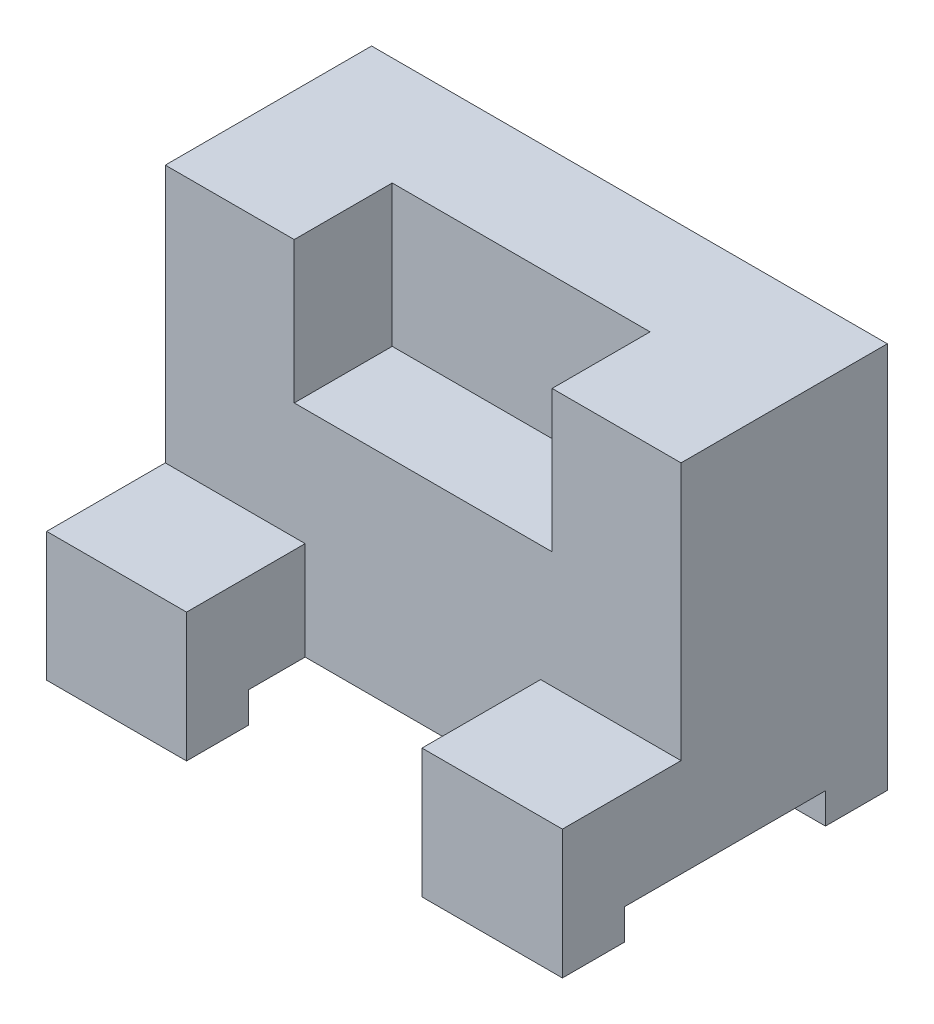
ISO-10303-21;
HEADER;
FILE_DESCRIPTION(('STEP AP214'),'2;1');
FILE_NAME('part.step','',(''),(''),'','','');
FILE_SCHEMA(('AUTOMOTIVE_DESIGN { 1 0 10303 214 1 1 1 1 }'));
ENDSEC;
DATA;
#1=APPLICATION_CONTEXT('core data for automotive mechanical design processes');
#2=APPLICATION_PROTOCOL_DEFINITION('international standard','automotive_design',2000,#1);
#3=PRODUCT_CONTEXT('',#1,'mechanical');
#4=PRODUCT('Part','Part','',(#3));
#5=PRODUCT_RELATED_PRODUCT_CATEGORY('part','',(#4));
#6=PRODUCT_DEFINITION_FORMATION('','',#4);
#7=PRODUCT_DEFINITION_CONTEXT('part definition',#1,'design');
#8=PRODUCT_DEFINITION('design','',#6,#7);
#9=PRODUCT_DEFINITION_SHAPE('','',#8);
#10=(LENGTH_UNIT() NAMED_UNIT(*) SI_UNIT(.MILLI.,.METRE.));
#11=(NAMED_UNIT(*) PLANE_ANGLE_UNIT() SI_UNIT($,.RADIAN.));
#12=(NAMED_UNIT(*) SI_UNIT($,.STERADIAN.) SOLID_ANGLE_UNIT());
#13=UNCERTAINTY_MEASURE_WITH_UNIT(LENGTH_MEASURE(1.E-05),#10,'distance_accuracy_value','');
#14=(GEOMETRIC_REPRESENTATION_CONTEXT(3) GLOBAL_UNCERTAINTY_ASSIGNED_CONTEXT((#13)) GLOBAL_UNIT_ASSIGNED_CONTEXT((#10,
#11,#12)) REPRESENTATION_CONTEXT('',''));
#15=CARTESIAN_POINT('',(0.,0.,0.));
#16=DIRECTION('',(0.,0.,1.));
#17=DIRECTION('',(1.,0.,0.));
#18=AXIS2_PLACEMENT_3D('',#15,#16,#17);
#19=CARTESIAN_POINT('',(0.,0.,63.));
#20=DIRECTION('',(0.,1.,0.));
#21=DIRECTION('',(0.,0.,1.));
#22=AXIS2_PLACEMENT_3D('',#19,#20,#21);
#23=PLANE('',#22);
#24=DIRECTION('',(0.,0.,-1.));
#25=VECTOR('',#24,1.);
#26=CARTESIAN_POINT('',(100.,0.,63.));
#27=LINE('',#26,#25);
#28=CARTESIAN_POINT('',(100.,0.,12.));
#29=VERTEX_POINT('',#28);
#30=CARTESIAN_POINT('',(100.,0.,0.));
#31=VERTEX_POINT('',#30);
#32=EDGE_CURVE('E191',#29,#31,#27,.T.);
#33=ORIENTED_EDGE('',*,*,#32,.F.);
#34=DIRECTION('',(-1.,0.,0.));
#35=VECTOR('',#34,1.);
#36=CARTESIAN_POINT('',(100.,0.,12.));
#37=LINE('',#36,#35);
#38=CARTESIAN_POINT('',(0.,0.,12.));
#39=VERTEX_POINT('',#38);
#40=EDGE_CURVE('E174',#29,#39,#37,.T.);
#41=ORIENTED_EDGE('',*,*,#40,.T.);
#42=DIRECTION('',(0.,0.,-1.));
#43=VECTOR('',#42,1.);
#44=CARTESIAN_POINT('',(0.,0.,63.));
#45=LINE('',#44,#43);
#46=CARTESIAN_POINT('',(0.,0.,0.));
#47=VERTEX_POINT('',#46);
#48=EDGE_CURVE('E276',#39,#47,#45,.T.);
#49=ORIENTED_EDGE('',*,*,#48,.T.);
#50=DIRECTION('',(1.,0.,0.));
#51=VECTOR('',#50,1.);
#52=CARTESIAN_POINT('',(0.,0.,0.));
#53=LINE('',#52,#51);
#54=EDGE_CURVE('E200',#47,#31,#53,.T.);
#55=ORIENTED_EDGE('',*,*,#54,.T.);
#56=EDGE_LOOP('',(#33,#41,#49,#55));
#57=FACE_BOUND('',#56,.T.);
#58=ADVANCED_FACE('F36',(#57),#23,.F.);
#59=CARTESIAN_POINT('',(0.,0.,63.));
#60=VERTEX_POINT('',#59);
#61=CARTESIAN_POINT('',(0.,0.,51.));
#62=VERTEX_POINT('',#61);
#63=EDGE_CURVE('E282',#60,#62,#45,.T.);
#64=ORIENTED_EDGE('',*,*,#63,.T.);
#65=DIRECTION('',(-1.,0.,0.));
#66=VECTOR('',#65,1.);
#67=CARTESIAN_POINT('',(100.,0.,51.));
#68=LINE('',#67,#66);
#69=CARTESIAN_POINT('',(27.1204188481676,0.,51.));
#70=VERTEX_POINT('',#69);
#71=EDGE_CURVE('E185',#70,#62,#68,.T.);
#72=ORIENTED_EDGE('',*,*,#71,.F.);
#73=DIRECTION('',(0.,0.,-1.));
#74=VECTOR('',#73,1.);
#75=CARTESIAN_POINT('',(27.1204188481675,0.,63.));
#76=LINE('',#75,#74);
#77=CARTESIAN_POINT('',(27.1204188481675,0.,63.));
#78=VERTEX_POINT('',#77);
#79=EDGE_CURVE('E294',#78,#70,#76,.T.);
#80=ORIENTED_EDGE('',*,*,#79,.F.);
#81=DIRECTION('',(1.,0.,0.));
#82=VECTOR('',#81,1.);
#83=CARTESIAN_POINT('',(0.,0.,63.));
#84=LINE('',#83,#82);
#85=EDGE_CURVE('E260',#60,#78,#84,.T.);
#86=ORIENTED_EDGE('',*,*,#85,.F.);
#87=EDGE_LOOP('',(#64,#72,#80,#86));
#88=FACE_BOUND('',#87,.T.);
#89=ADVANCED_FACE('F480',(#88),#23,.F.);
#90=CARTESIAN_POINT('',(0.,75.,40.));
#91=DIRECTION('',(0.,1.,0.));
#92=DIRECTION('',(0.,0.,1.));
#93=AXIS2_PLACEMENT_3D('',#90,#91,#92);
#94=PLANE('',#93);
#95=DIRECTION('',(1.,0.,0.));
#96=VECTOR('',#95,1.);
#97=CARTESIAN_POINT('',(0.,75.,40.));
#98=LINE('',#97,#96);
#99=CARTESIAN_POINT('',(0.,75.,40.));
#100=VERTEX_POINT('',#99);
#101=CARTESIAN_POINT('',(25.,75.,40.));
#102=VERTEX_POINT('',#101);
#103=EDGE_CURVE('E220',#100,#102,#98,.T.);
#104=ORIENTED_EDGE('',*,*,#103,.T.);
#105=DIRECTION('',(0.,0.,1.));
#106=VECTOR('',#105,1.);
#107=CARTESIAN_POINT('',(25.,75.,21.));
#108=LINE('',#107,#106);
#109=CARTESIAN_POINT('',(25.,75.,21.));
#110=VERTEX_POINT('',#109);
#111=EDGE_CURVE('E372',#110,#102,#108,.T.);
#112=ORIENTED_EDGE('',*,*,#111,.F.);
#113=DIRECTION('',(-1.,0.,0.));
#114=VECTOR('',#113,1.);
#115=CARTESIAN_POINT('',(0.,75.,21.));
#116=LINE('',#115,#114);
#117=CARTESIAN_POINT('',(75.,75.,21.));
#118=VERTEX_POINT('',#117);
#119=EDGE_CURVE('E429',#118,#110,#116,.T.);
#120=ORIENTED_EDGE('',*,*,#119,.F.);
#121=DIRECTION('',(0.,0.,1.));
#122=VECTOR('',#121,1.);
#123=CARTESIAN_POINT('',(75.,75.,21.));
#124=LINE('',#123,#122);
#125=CARTESIAN_POINT('',(75.,75.,40.));
#126=VERTEX_POINT('',#125);
#127=EDGE_CURVE('E397',#118,#126,#124,.T.);
#128=ORIENTED_EDGE('',*,*,#127,.T.);
#129=CARTESIAN_POINT('',(100.,75.,40.));
#130=VERTEX_POINT('',#129);
#131=EDGE_CURVE('E225',#126,#130,#98,.T.);
#132=ORIENTED_EDGE('',*,*,#131,.T.);
#133=DIRECTION('',(0.,0.,-1.));
#134=VECTOR('',#133,1.);
#135=CARTESIAN_POINT('',(100.,75.,40.));
#136=LINE('',#135,#134);
#137=CARTESIAN_POINT('',(100.,75.,0.));
#138=VERTEX_POINT('',#137);
#139=EDGE_CURVE('E247',#130,#138,#136,.T.);
#140=ORIENTED_EDGE('',*,*,#139,.T.);
#141=DIRECTION('',(1.,0.,0.));
#142=VECTOR('',#141,1.);
#143=CARTESIAN_POINT('',(0.,75.,0.));
#144=LINE('',#143,#142);
#145=CARTESIAN_POINT('',(0.,75.,0.));
#146=VERTEX_POINT('',#145);
#147=EDGE_CURVE('E219',#146,#138,#144,.T.);
#148=ORIENTED_EDGE('',*,*,#147,.F.);
#149=DIRECTION('',(0.,0.,-1.));
#150=VECTOR('',#149,1.);
#151=CARTESIAN_POINT('',(0.,75.,40.));
#152=LINE('',#151,#150);
#153=EDGE_CURVE('E256',#100,#146,#152,.T.);
#154=ORIENTED_EDGE('',*,*,#153,.F.);
#155=EDGE_LOOP('',(#104,#112,#120,#128,#132,#140,#148,#154));
#156=FACE_BOUND('',#155,.T.);
#157=ADVANCED_FACE('F369',(#156),#94,.T.);
#158=CARTESIAN_POINT('',(0.,0.,40.));
#159=DIRECTION('',(0.,0.,1.));
#160=DIRECTION('',(1.,0.,0.));
#161=AXIS2_PLACEMENT_3D('',#158,#159,#160);
#162=PLANE('',#161);
#163=DIRECTION('',(-1.,0.,0.));
#164=VECTOR('',#163,1.);
#165=CARTESIAN_POINT('',(0.,5.94692633548565,40.));
#166=LINE('',#165,#164);
#167=CARTESIAN_POINT('',(72.7748691099477,5.94692633548565,40.));
#168=VERTEX_POINT('',#167);
#169=CARTESIAN_POINT('',(27.1204188481675,5.94692633548565,40.));
#170=VERTEX_POINT('',#169);
#171=EDGE_CURVE('E320',#168,#170,#166,.T.);
#172=ORIENTED_EDGE('',*,*,#171,.F.);
#173=DIRECTION('',(0.,1.,0.));
#174=VECTOR('',#173,1.);
#175=CARTESIAN_POINT('',(72.7748691099477,0.,40.));
#176=LINE('',#175,#174);
#177=CARTESIAN_POINT('',(72.7748691099477,25.,40.));
#178=VERTEX_POINT('',#177);
#179=EDGE_CURVE('E236',#168,#178,#176,.T.);
#180=ORIENTED_EDGE('',*,*,#179,.T.);
#181=DIRECTION('',(-1.,0.,0.));
#182=VECTOR('',#181,1.);
#183=CARTESIAN_POINT('',(0.,25.,40.));
#184=LINE('',#183,#182);
#185=CARTESIAN_POINT('',(100.,25.,40.));
#186=VERTEX_POINT('',#185);
#187=EDGE_CURVE('E239',#186,#178,#184,.T.);
#188=ORIENTED_EDGE('',*,*,#187,.F.);
#189=DIRECTION('',(0.,1.,0.));
#190=VECTOR('',#189,1.);
#191=CARTESIAN_POINT('',(100.,0.,40.));
#192=LINE('',#191,#190);
#193=EDGE_CURVE('E243',#186,#130,#192,.T.);
#194=ORIENTED_EDGE('',*,*,#193,.T.);
#195=ORIENTED_EDGE('',*,*,#131,.F.);
#196=DIRECTION('',(0.,1.,0.));
#197=VECTOR('',#196,1.);
#198=CARTESIAN_POINT('',(75.,0.,40.));
#199=LINE('',#198,#197);
#200=CARTESIAN_POINT('',(75.,47.565445026178,40.));
#201=VERTEX_POINT('',#200);
#202=EDGE_CURVE('E332',#201,#126,#199,.T.);
#203=ORIENTED_EDGE('',*,*,#202,.F.);
#204=DIRECTION('',(-1.,0.,0.));
#205=VECTOR('',#204,1.);
#206=CARTESIAN_POINT('',(0.,47.565445026178,40.));
#207=LINE('',#206,#205);
#208=CARTESIAN_POINT('',(25.,47.565445026178,40.));
#209=VERTEX_POINT('',#208);
#210=EDGE_CURVE('E374',#201,#209,#207,.T.);
#211=ORIENTED_EDGE('',*,*,#210,.T.);
#212=DIRECTION('',(0.,1.,0.));
#213=VECTOR('',#212,1.);
#214=CARTESIAN_POINT('',(25.,0.,40.));
#215=LINE('',#214,#213);
#216=EDGE_CURVE('E60',#209,#102,#215,.T.);
#217=ORIENTED_EDGE('',*,*,#216,.T.);
#218=ORIENTED_EDGE('',*,*,#103,.F.);
#219=DIRECTION('',(0.,1.,0.));
#220=VECTOR('',#219,1.);
#221=CARTESIAN_POINT('',(0.,0.,40.));
#222=LINE('',#221,#220);
#223=CARTESIAN_POINT('',(0.,25.,40.));
#224=VERTEX_POINT('',#223);
#225=EDGE_CURVE('E224',#224,#100,#222,.T.);
#226=ORIENTED_EDGE('',*,*,#225,.F.);
#227=DIRECTION('',(1.,0.,0.));
#228=VECTOR('',#227,1.);
#229=CARTESIAN_POINT('',(0.,25.,40.));
#230=LINE('',#229,#228);
#231=CARTESIAN_POINT('',(27.1204188481675,25.,40.));
#232=VERTEX_POINT('',#231);
#233=EDGE_CURVE('E229',#224,#232,#230,.T.);
#234=ORIENTED_EDGE('',*,*,#233,.T.);
#235=DIRECTION('',(0.,1.,0.));
#236=VECTOR('',#235,1.);
#237=CARTESIAN_POINT('',(27.1204188481675,0.,40.));
#238=LINE('',#237,#236);
#239=EDGE_CURVE('E233',#170,#232,#238,.T.);
#240=ORIENTED_EDGE('',*,*,#239,.F.);
#241=EDGE_LOOP('',(#172,#180,#188,#194,#195,#203,#211,#217,#218,#226,#234,#240));
#242=FACE_BOUND('',#241,.T.);
#243=ADVANCED_FACE('F318',(#242),#162,.T.);
#244=DIRECTION('',(0.,0.,-1.));
#245=VECTOR('',#244,1.);
#246=CARTESIAN_POINT('',(72.7748691099477,0.,63.));
#247=LINE('',#246,#245);
#248=CARTESIAN_POINT('',(72.7748691099477,0.,63.));
#249=VERTEX_POINT('',#248);
#250=CARTESIAN_POINT('',(72.7748691099477,0.,51.));
#251=VERTEX_POINT('',#250);
#252=EDGE_CURVE('E210',#249,#251,#247,.T.);
#253=ORIENTED_EDGE('',*,*,#252,.T.);
#254=CARTESIAN_POINT('',(100.,0.,51.));
#255=VERTEX_POINT('',#254);
#256=EDGE_CURVE('E52',#255,#251,#68,.T.);
#257=ORIENTED_EDGE('',*,*,#256,.F.);
#258=CARTESIAN_POINT('',(100.,0.,63.));
#259=VERTEX_POINT('',#258);
#260=EDGE_CURVE('E203',#259,#255,#27,.T.);
#261=ORIENTED_EDGE('',*,*,#260,.F.);
#262=DIRECTION('',(1.,0.,0.));
#263=VECTOR('',#262,1.);
#264=CARTESIAN_POINT('',(0.,0.,63.));
#265=LINE('',#264,#263);
#266=EDGE_CURVE('E405',#249,#259,#265,.T.);
#267=ORIENTED_EDGE('',*,*,#266,.F.);
#268=EDGE_LOOP('',(#253,#257,#261,#267));
#269=FACE_BOUND('',#268,.T.);
#270=ADVANCED_FACE('F38',(#269),#23,.F.);
#271=CARTESIAN_POINT('',(27.1204188481675,0.,63.));
#272=DIRECTION('',(-1.,0.,0.));
#273=DIRECTION('',(0.,0.,1.));
#274=AXIS2_PLACEMENT_3D('',#271,#272,#273);
#275=PLANE('',#274);
#276=DIRECTION('',(0.,1.,0.));
#277=VECTOR('',#276,1.);
#278=CARTESIAN_POINT('',(27.1204188481675,0.,51.));
#279=LINE('',#278,#277);
#280=CARTESIAN_POINT('',(27.1204188481676,5.94692633548565,51.));
#281=VERTEX_POINT('',#280);
#282=EDGE_CURVE('E442',#70,#281,#279,.T.);
#283=ORIENTED_EDGE('',*,*,#282,.T.);
#284=DIRECTION('',(0.,0.,-1.));
#285=VECTOR('',#284,1.);
#286=CARTESIAN_POINT('',(27.1204188481675,5.94692633548565,63.));
#287=LINE('',#286,#285);
#288=EDGE_CURVE('E376',#281,#170,#287,.T.);
#289=ORIENTED_EDGE('',*,*,#288,.T.);
#290=ORIENTED_EDGE('',*,*,#239,.T.);
#291=DIRECTION('',(0.,0.,-1.));
#292=VECTOR('',#291,1.);
#293=CARTESIAN_POINT('',(27.1204188481675,25.,63.));
#294=LINE('',#293,#292);
#295=CARTESIAN_POINT('',(27.1204188481675,25.,63.));
#296=VERTEX_POINT('',#295);
#297=EDGE_CURVE('E290',#296,#232,#294,.T.);
#298=ORIENTED_EDGE('',*,*,#297,.F.);
#299=DIRECTION('',(0.,1.,0.));
#300=VECTOR('',#299,1.);
#301=CARTESIAN_POINT('',(27.1204188481675,0.,63.));
#302=LINE('',#301,#300);
#303=EDGE_CURVE('E264',#78,#296,#302,.T.);
#304=ORIENTED_EDGE('',*,*,#303,.F.);
#305=ORIENTED_EDGE('',*,*,#79,.T.);
#306=EDGE_LOOP('',(#283,#289,#290,#298,#304,#305));
#307=FACE_BOUND('',#306,.T.);
#308=ADVANCED_FACE('F486',(#307),#275,.F.);
#309=CARTESIAN_POINT('',(0.,25.,63.));
#310=DIRECTION('',(0.,1.,0.));
#311=DIRECTION('',(0.,0.,1.));
#312=AXIS2_PLACEMENT_3D('',#309,#310,#311);
#313=PLANE('',#312);
#314=ORIENTED_EDGE('',*,*,#233,.F.);
#315=DIRECTION('',(0.,0.,-1.));
#316=VECTOR('',#315,1.);
#317=CARTESIAN_POINT('',(0.,25.,63.));
#318=LINE('',#317,#316);
#319=CARTESIAN_POINT('',(0.,25.,63.));
#320=VERTEX_POINT('',#319);
#321=EDGE_CURVE('E286',#320,#224,#318,.T.);
#322=ORIENTED_EDGE('',*,*,#321,.F.);
#323=DIRECTION('',(1.,0.,0.));
#324=VECTOR('',#323,1.);
#325=CARTESIAN_POINT('',(0.,25.,63.));
#326=LINE('',#325,#324);
#327=EDGE_CURVE('E268',#320,#296,#326,.T.);
#328=ORIENTED_EDGE('',*,*,#327,.T.);
#329=ORIENTED_EDGE('',*,*,#297,.T.);
#330=EDGE_LOOP('',(#314,#322,#328,#329));
#331=FACE_BOUND('',#330,.T.);
#332=ADVANCED_FACE('F491',(#331),#313,.T.);
#333=CARTESIAN_POINT('',(0.,0.,63.));
#334=DIRECTION('',(-1.,0.,0.));
#335=DIRECTION('',(0.,0.,1.));
#336=AXIS2_PLACEMENT_3D('',#333,#334,#335);
#337=PLANE('',#336);
#338=DIRECTION('',(0.,-1.,0.));
#339=VECTOR('',#338,1.);
#340=CARTESIAN_POINT('',(0.,0.,12.));
#341=LINE('',#340,#339);
#342=CARTESIAN_POINT('',(0.,5.94692633548565,12.));
#343=VERTEX_POINT('',#342);
#344=EDGE_CURVE('E180',#343,#39,#341,.T.);
#345=ORIENTED_EDGE('',*,*,#344,.F.);
#346=DIRECTION('',(0.,0.,-1.));
#347=VECTOR('',#346,1.);
#348=CARTESIAN_POINT('',(0.,5.94692633548565,12.));
#349=LINE('',#348,#347);
#350=CARTESIAN_POINT('',(0.,5.94692633548565,51.));
#351=VERTEX_POINT('',#350);
#352=EDGE_CURVE('E197',#351,#343,#349,.T.);
#353=ORIENTED_EDGE('',*,*,#352,.F.);
#354=DIRECTION('',(0.,1.,0.));
#355=VECTOR('',#354,1.);
#356=CARTESIAN_POINT('',(0.,0.,51.));
#357=LINE('',#356,#355);
#358=EDGE_CURVE('E453',#62,#351,#357,.T.);
#359=ORIENTED_EDGE('',*,*,#358,.F.);
#360=ORIENTED_EDGE('',*,*,#63,.F.);
#361=DIRECTION('',(0.,1.,0.));
#362=VECTOR('',#361,1.);
#363=CARTESIAN_POINT('',(0.,0.,63.));
#364=LINE('',#363,#362);
#365=EDGE_CURVE('E272',#60,#320,#364,.T.);
#366=ORIENTED_EDGE('',*,*,#365,.T.);
#367=ORIENTED_EDGE('',*,*,#321,.T.);
#368=ORIENTED_EDGE('',*,*,#225,.T.);
#369=ORIENTED_EDGE('',*,*,#153,.T.);
#370=DIRECTION('',(0.,1.,0.));
#371=VECTOR('',#370,1.);
#372=CARTESIAN_POINT('',(0.,0.,0.));
#373=LINE('',#372,#371);
#374=EDGE_CURVE('E265',#47,#146,#373,.T.);
#375=ORIENTED_EDGE('',*,*,#374,.F.);
#376=ORIENTED_EDGE('',*,*,#48,.F.);
#377=EDGE_LOOP('',(#345,#353,#359,#360,#366,#367,#368,#369,#375,#376));
#378=FACE_BOUND('',#377,.T.);
#379=ADVANCED_FACE('F366',(#378),#337,.T.);
#380=CARTESIAN_POINT('',(0.,0.,63.));
#381=DIRECTION('',(0.,0.,1.));
#382=DIRECTION('',(1.,0.,0.));
#383=AXIS2_PLACEMENT_3D('',#380,#381,#382);
#384=PLANE('',#383);
#385=ORIENTED_EDGE('',*,*,#85,.T.);
#386=ORIENTED_EDGE('',*,*,#303,.T.);
#387=ORIENTED_EDGE('',*,*,#327,.F.);
#388=ORIENTED_EDGE('',*,*,#365,.F.);
#389=EDGE_LOOP('',(#385,#386,#387,#388));
#390=FACE_BOUND('',#389,.T.);
#391=ADVANCED_FACE('F502',(#390),#384,.T.);
#392=CARTESIAN_POINT('',(0.,0.,0.));
#393=DIRECTION('',(0.,0.,1.));
#394=DIRECTION('',(1.,0.,0.));
#395=AXIS2_PLACEMENT_3D('',#392,#393,#394);
#396=PLANE('',#395);
#397=ORIENTED_EDGE('',*,*,#374,.T.);
#398=ORIENTED_EDGE('',*,*,#147,.T.);
#399=DIRECTION('',(0.,1.,0.));
#400=VECTOR('',#399,1.);
#401=CARTESIAN_POINT('',(100.,0.,0.));
#402=LINE('',#401,#400);
#403=EDGE_CURVE('E251',#31,#138,#402,.T.);
#404=ORIENTED_EDGE('',*,*,#403,.F.);
#405=ORIENTED_EDGE('',*,*,#54,.F.);
#406=EDGE_LOOP('',(#397,#398,#404,#405));
#407=FACE_BOUND('',#406,.T.);
#408=ADVANCED_FACE('F365',(#407),#396,.F.);
#409=CARTESIAN_POINT('',(100.,0.,40.));
#410=DIRECTION('',(-1.,0.,0.));
#411=DIRECTION('',(0.,0.,1.));
#412=AXIS2_PLACEMENT_3D('',#409,#410,#411);
#413=PLANE('',#412);
#414=DIRECTION('',(0.,0.,-1.));
#415=VECTOR('',#414,1.);
#416=CARTESIAN_POINT('',(100.,5.94692633548565,12.));
#417=LINE('',#416,#415);
#418=CARTESIAN_POINT('',(100.,5.94692633548565,51.));
#419=VERTEX_POINT('',#418);
#420=CARTESIAN_POINT('',(100.,5.94692633548565,12.));
#421=VERTEX_POINT('',#420);
#422=EDGE_CURVE('E186',#419,#421,#417,.T.);
#423=ORIENTED_EDGE('',*,*,#422,.T.);
#424=DIRECTION('',(0.,-1.,0.));
#425=VECTOR('',#424,1.);
#426=CARTESIAN_POINT('',(100.,0.,12.));
#427=LINE('',#426,#425);
#428=EDGE_CURVE('E177',#421,#29,#427,.T.);
#429=ORIENTED_EDGE('',*,*,#428,.T.);
#430=ORIENTED_EDGE('',*,*,#32,.T.);
#431=ORIENTED_EDGE('',*,*,#403,.T.);
#432=ORIENTED_EDGE('',*,*,#139,.F.);
#433=ORIENTED_EDGE('',*,*,#193,.F.);
#434=DIRECTION('',(0.,0.,-1.));
#435=VECTOR('',#434,1.);
#436=CARTESIAN_POINT('',(100.,25.,63.));
#437=LINE('',#436,#435);
#438=CARTESIAN_POINT('',(100.,25.,63.));
#439=VERTEX_POINT('',#438);
#440=EDGE_CURVE('E204',#439,#186,#437,.T.);
#441=ORIENTED_EDGE('',*,*,#440,.F.);
#442=DIRECTION('',(0.,1.,0.));
#443=VECTOR('',#442,1.);
#444=CARTESIAN_POINT('',(100.,0.,63.));
#445=LINE('',#444,#443);
#446=EDGE_CURVE('E327',#259,#439,#445,.T.);
#447=ORIENTED_EDGE('',*,*,#446,.F.);
#448=ORIENTED_EDGE('',*,*,#260,.T.);
#449=DIRECTION('',(0.,1.,0.));
#450=VECTOR('',#449,1.);
#451=CARTESIAN_POINT('',(100.,0.,51.));
#452=LINE('',#451,#450);
#453=EDGE_CURVE('E196',#255,#419,#452,.T.);
#454=ORIENTED_EDGE('',*,*,#453,.T.);
#455=EDGE_LOOP('',(#423,#429,#430,#431,#432,#433,#441,#447,#448,#454));
#456=FACE_BOUND('',#455,.T.);
#457=ADVANCED_FACE('F189',(#456),#413,.F.);
#458=CARTESIAN_POINT('',(72.7748691099477,0.,63.));
#459=DIRECTION('',(-1.,0.,0.));
#460=DIRECTION('',(0.,0.,1.));
#461=AXIS2_PLACEMENT_3D('',#458,#459,#460);
#462=PLANE('',#461);
#463=DIRECTION('',(0.,0.,-1.));
#464=VECTOR('',#463,1.);
#465=CARTESIAN_POINT('',(72.7748691099477,5.94692633548565,63.));
#466=LINE('',#465,#464);
#467=CARTESIAN_POINT('',(72.7748691099477,5.94692633548565,51.));
#468=VERTEX_POINT('',#467);
#469=EDGE_CURVE('E11',#468,#168,#466,.T.);
#470=ORIENTED_EDGE('',*,*,#469,.F.);
#471=DIRECTION('',(0.,1.,0.));
#472=VECTOR('',#471,1.);
#473=CARTESIAN_POINT('',(72.7748691099477,0.,51.));
#474=LINE('',#473,#472);
#475=EDGE_CURVE('E45',#251,#468,#474,.T.);
#476=ORIENTED_EDGE('',*,*,#475,.F.);
#477=ORIENTED_EDGE('',*,*,#252,.F.);
#478=DIRECTION('',(0.,1.,0.));
#479=VECTOR('',#478,1.);
#480=CARTESIAN_POINT('',(72.7748691099477,0.,63.));
#481=LINE('',#480,#479);
#482=CARTESIAN_POINT('',(72.7748691099477,25.,63.));
#483=VERTEX_POINT('',#482);
#484=EDGE_CURVE('E402',#249,#483,#481,.T.);
#485=ORIENTED_EDGE('',*,*,#484,.T.);
#486=DIRECTION('',(0.,0.,-1.));
#487=VECTOR('',#486,1.);
#488=CARTESIAN_POINT('',(72.7748691099477,25.,63.));
#489=LINE('',#488,#487);
#490=EDGE_CURVE('E212',#483,#178,#489,.T.);
#491=ORIENTED_EDGE('',*,*,#490,.T.);
#492=ORIENTED_EDGE('',*,*,#179,.F.);
#493=EDGE_LOOP('',(#470,#476,#477,#485,#491,#492));
#494=FACE_BOUND('',#493,.T.);
#495=ADVANCED_FACE('F312',(#494),#462,.T.);
#496=CARTESIAN_POINT('',(0.,25.,63.));
#497=DIRECTION('',(0.,-1.,0.));
#498=DIRECTION('',(1.,0.,0.));
#499=AXIS2_PLACEMENT_3D('',#496,#497,#498);
#500=PLANE('',#499);
#501=ORIENTED_EDGE('',*,*,#187,.T.);
#502=ORIENTED_EDGE('',*,*,#490,.F.);
#503=DIRECTION('',(-1.,0.,0.));
#504=VECTOR('',#503,1.);
#505=CARTESIAN_POINT('',(0.,25.,63.));
#506=LINE('',#505,#504);
#507=EDGE_CURVE('E325',#439,#483,#506,.T.);
#508=ORIENTED_EDGE('',*,*,#507,.F.);
#509=ORIENTED_EDGE('',*,*,#440,.T.);
#510=EDGE_LOOP('',(#501,#502,#508,#509));
#511=FACE_BOUND('',#510,.T.);
#512=ADVANCED_FACE('F322',(#511),#500,.F.);
#513=CARTESIAN_POINT('',(0.,0.,63.));
#514=DIRECTION('',(0.,0.,1.));
#515=DIRECTION('',(1.,0.,0.));
#516=AXIS2_PLACEMENT_3D('',#513,#514,#515);
#517=PLANE('',#516);
#518=ORIENTED_EDGE('',*,*,#484,.F.);
#519=ORIENTED_EDGE('',*,*,#266,.T.);
#520=ORIENTED_EDGE('',*,*,#446,.T.);
#521=ORIENTED_EDGE('',*,*,#507,.T.);
#522=EDGE_LOOP('',(#518,#519,#520,#521));
#523=FACE_BOUND('',#522,.T.);
#524=ADVANCED_FACE('F468',(#523),#517,.T.);
#525=CARTESIAN_POINT('',(25.,0.,21.));
#526=DIRECTION('',(1.,0.,0.));
#527=DIRECTION('',(0.,1.,0.));
#528=AXIS2_PLACEMENT_3D('',#525,#526,#527);
#529=PLANE('',#528);
#530=ORIENTED_EDGE('',*,*,#216,.F.);
#531=DIRECTION('',(0.,0.,1.));
#532=VECTOR('',#531,1.);
#533=CARTESIAN_POINT('',(25.,47.565445026178,21.));
#534=LINE('',#533,#532);
#535=CARTESIAN_POINT('',(25.,47.565445026178,21.));
#536=VERTEX_POINT('',#535);
#537=EDGE_CURVE('E391',#536,#209,#534,.T.);
#538=ORIENTED_EDGE('',*,*,#537,.F.);
#539=DIRECTION('',(0.,1.,0.));
#540=VECTOR('',#539,1.);
#541=CARTESIAN_POINT('',(25.,0.,21.));
#542=LINE('',#541,#540);
#543=EDGE_CURVE('E390',#536,#110,#542,.T.);
#544=ORIENTED_EDGE('',*,*,#543,.T.);
#545=ORIENTED_EDGE('',*,*,#111,.T.);
#546=EDGE_LOOP('',(#530,#538,#544,#545));
#547=FACE_BOUND('',#546,.T.);
#548=ADVANCED_FACE('F470',(#547),#529,.T.);
#549=CARTESIAN_POINT('',(75.,0.,21.));
#550=DIRECTION('',(1.,0.,0.));
#551=DIRECTION('',(0.,1.,0.));
#552=AXIS2_PLACEMENT_3D('',#549,#550,#551);
#553=PLANE('',#552);
#554=ORIENTED_EDGE('',*,*,#202,.T.);
#555=ORIENTED_EDGE('',*,*,#127,.F.);
#556=DIRECTION('',(0.,1.,0.));
#557=VECTOR('',#556,1.);
#558=CARTESIAN_POINT('',(75.,0.,21.));
#559=LINE('',#558,#557);
#560=CARTESIAN_POINT('',(75.,47.565445026178,21.));
#561=VERTEX_POINT('',#560);
#562=EDGE_CURVE('E425',#561,#118,#559,.T.);
#563=ORIENTED_EDGE('',*,*,#562,.F.);
#564=DIRECTION('',(0.,0.,1.));
#565=VECTOR('',#564,1.);
#566=CARTESIAN_POINT('',(75.,47.565445026178,21.));
#567=LINE('',#566,#565);
#568=EDGE_CURVE('E394',#561,#201,#567,.T.);
#569=ORIENTED_EDGE('',*,*,#568,.T.);
#570=EDGE_LOOP('',(#554,#555,#563,#569));
#571=FACE_BOUND('',#570,.T.);
#572=ADVANCED_FACE('F476',(#571),#553,.F.);
#573=CARTESIAN_POINT('',(0.,47.565445026178,21.));
#574=DIRECTION('',(0.,1.,0.));
#575=DIRECTION('',(-1.,0.,0.));
#576=AXIS2_PLACEMENT_3D('',#573,#574,#575);
#577=PLANE('',#576);
#578=ORIENTED_EDGE('',*,*,#210,.F.);
#579=ORIENTED_EDGE('',*,*,#568,.F.);
#580=DIRECTION('',(-1.,0.,0.));
#581=VECTOR('',#580,1.);
#582=CARTESIAN_POINT('',(0.,47.565445026178,21.));
#583=LINE('',#582,#581);
#584=EDGE_CURVE('E385',#561,#536,#583,.T.);
#585=ORIENTED_EDGE('',*,*,#584,.T.);
#586=ORIENTED_EDGE('',*,*,#537,.T.);
#587=EDGE_LOOP('',(#578,#579,#585,#586));
#588=FACE_BOUND('',#587,.T.);
#589=ADVANCED_FACE('F573',(#588),#577,.T.);
#590=CARTESIAN_POINT('',(0.,0.,21.));
#591=DIRECTION('',(0.,0.,1.));
#592=DIRECTION('',(1.,0.,0.));
#593=AXIS2_PLACEMENT_3D('',#590,#591,#592);
#594=PLANE('',#593);
#595=ORIENTED_EDGE('',*,*,#543,.F.);
#596=ORIENTED_EDGE('',*,*,#584,.F.);
#597=ORIENTED_EDGE('',*,*,#562,.T.);
#598=ORIENTED_EDGE('',*,*,#119,.T.);
#599=EDGE_LOOP('',(#595,#596,#597,#598));
#600=FACE_BOUND('',#599,.T.);
#601=ADVANCED_FACE('F544',(#600),#594,.T.);
#602=CARTESIAN_POINT('',(100.,5.94692633548565,12.));
#603=DIRECTION('',(0.,1.,0.));
#604=DIRECTION('',(0.,0.,1.));
#605=AXIS2_PLACEMENT_3D('',#602,#603,#604);
#606=PLANE('',#605);
#607=DIRECTION('',(-1.,0.,0.));
#608=VECTOR('',#607,1.);
#609=CARTESIAN_POINT('',(100.,5.94692633548565,51.));
#610=LINE('',#609,#608);
#611=EDGE_CURVE('E309',#281,#351,#610,.T.);
#612=ORIENTED_EDGE('',*,*,#611,.T.);
#613=ORIENTED_EDGE('',*,*,#352,.T.);
#614=DIRECTION('',(-1.,0.,0.));
#615=VECTOR('',#614,1.);
#616=CARTESIAN_POINT('',(100.,5.94692633548565,12.));
#617=LINE('',#616,#615);
#618=EDGE_CURVE('E308',#421,#343,#617,.T.);
#619=ORIENTED_EDGE('',*,*,#618,.F.);
#620=ORIENTED_EDGE('',*,*,#422,.F.);
#621=EDGE_CURVE('E301',#419,#468,#610,.T.);
#622=ORIENTED_EDGE('',*,*,#621,.T.);
#623=ORIENTED_EDGE('',*,*,#469,.T.);
#624=ORIENTED_EDGE('',*,*,#171,.T.);
#625=ORIENTED_EDGE('',*,*,#288,.F.);
#626=EDGE_LOOP('',(#612,#613,#619,#620,#622,#623,#624,#625));
#627=FACE_BOUND('',#626,.T.);
#628=ADVANCED_FACE('F305',(#627),#606,.F.);
#629=CARTESIAN_POINT('',(100.,0.,51.));
#630=DIRECTION('',(0.,0.,1.));
#631=DIRECTION('',(1.,0.,0.));
#632=AXIS2_PLACEMENT_3D('',#629,#630,#631);
#633=PLANE('',#632);
#634=ORIENTED_EDGE('',*,*,#71,.T.);
#635=ORIENTED_EDGE('',*,*,#358,.T.);
#636=ORIENTED_EDGE('',*,*,#611,.F.);
#637=ORIENTED_EDGE('',*,*,#282,.F.);
#638=EDGE_LOOP('',(#634,#635,#636,#637));
#639=FACE_BOUND('',#638,.T.);
#640=ADVANCED_FACE('F522',(#639),#633,.F.);
#641=CARTESIAN_POINT('',(100.,0.,12.));
#642=DIRECTION('',(0.,0.,-1.));
#643=DIRECTION('',(-1.,0.,0.));
#644=AXIS2_PLACEMENT_3D('',#641,#642,#643);
#645=PLANE('',#644);
#646=ORIENTED_EDGE('',*,*,#344,.T.);
#647=ORIENTED_EDGE('',*,*,#40,.F.);
#648=ORIENTED_EDGE('',*,*,#428,.F.);
#649=ORIENTED_EDGE('',*,*,#618,.T.);
#650=EDGE_LOOP('',(#646,#647,#648,#649));
#651=FACE_BOUND('',#650,.T.);
#652=ADVANCED_FACE('F176',(#651),#645,.F.);
#653=ORIENTED_EDGE('',*,*,#475,.T.);
#654=ORIENTED_EDGE('',*,*,#621,.F.);
#655=ORIENTED_EDGE('',*,*,#453,.F.);
#656=ORIENTED_EDGE('',*,*,#256,.T.);
#657=EDGE_LOOP('',(#653,#654,#655,#656));
#658=FACE_BOUND('',#657,.T.);
#659=ADVANCED_FACE('F300',(#658),#633,.F.);
#660=CLOSED_SHELL('',(#58,#89,#157,#243,#270,#308,#332,#379,#391,#408,#457,#495,#512,#524,#548,
#572,#589,#601,#628,#640,#652,#659));
#661=MANIFOLD_SOLID_BREP('B2',#660);
#662=ADVANCED_BREP_SHAPE_REPRESENTATION('',(#18,#661),#14);
#663=SHAPE_DEFINITION_REPRESENTATION(#9,#662);
ENDSEC;
END-ISO-10303-21;
